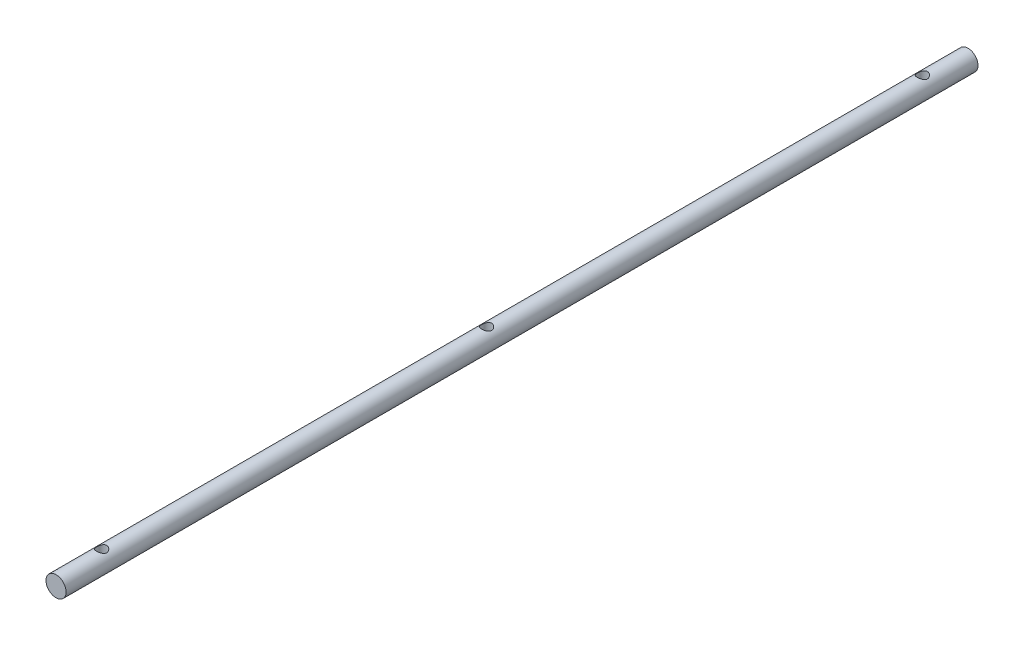
ISO-10303-21;
HEADER;
FILE_DESCRIPTION(('STEP AP214'),'2;1');
FILE_NAME('part.step','',(''),(''),'','','');
FILE_SCHEMA(('AUTOMOTIVE_DESIGN { 1 0 10303 214 1 1 1 1 }'));
ENDSEC;
DATA;
#1=APPLICATION_CONTEXT('core data for automotive mechanical design processes');
#2=APPLICATION_PROTOCOL_DEFINITION('international standard','automotive_design',2000,#1);
#3=PRODUCT_CONTEXT('',#1,'mechanical');
#4=PRODUCT('Part','Part','',(#3));
#5=PRODUCT_RELATED_PRODUCT_CATEGORY('part','',(#4));
#6=PRODUCT_DEFINITION_FORMATION('','',#4);
#7=PRODUCT_DEFINITION_CONTEXT('part definition',#1,'design');
#8=PRODUCT_DEFINITION('design','',#6,#7);
#9=PRODUCT_DEFINITION_SHAPE('','',#8);
#10=(LENGTH_UNIT() NAMED_UNIT(*) SI_UNIT(.MILLI.,.METRE.));
#11=(NAMED_UNIT(*) PLANE_ANGLE_UNIT() SI_UNIT($,.RADIAN.));
#12=(NAMED_UNIT(*) SI_UNIT($,.STERADIAN.) SOLID_ANGLE_UNIT());
#13=UNCERTAINTY_MEASURE_WITH_UNIT(LENGTH_MEASURE(1.E-05),#10,'distance_accuracy_value','');
#14=(GEOMETRIC_REPRESENTATION_CONTEXT(3) GLOBAL_UNCERTAINTY_ASSIGNED_CONTEXT((#13)) GLOBAL_UNIT_ASSIGNED_CONTEXT((#10,
#11,#12)) REPRESENTATION_CONTEXT('',''));
#15=CARTESIAN_POINT('',(0.,0.,0.));
#16=DIRECTION('',(0.,0.,1.));
#17=DIRECTION('',(1.,0.,0.));
#18=AXIS2_PLACEMENT_3D('',#15,#16,#17);
#19=CARTESIAN_POINT('',(0.,0.,180.));
#20=DIRECTION('',(0.,0.,-1.));
#21=DIRECTION('',(-1.,0.,0.));
#22=AXIS2_PLACEMENT_3D('',#19,#20,#21);
#23=CYLINDRICAL_SURFACE('',#22,1.985);
#24=CARTESIAN_POINT('',(0.,-1.985,172.));
#25=CARTESIAN_POINT('',(0.0525241934521383,-1.98499709998524,171.999996669648));
#26=CARTESIAN_POINT('',(0.105109572475808,-1.98289298866239,171.995837518645));
#27=CARTESIAN_POINT('',(0.208723131212675,-1.97468317302452,171.979386283019));
#28=CARTESIAN_POINT('',(0.259748227920028,-1.96857002233899,171.967079063806));
#29=CARTESIAN_POINT('',(0.358584817496942,-1.95298123682219,171.934936784323));
#30=CARTESIAN_POINT('',(0.406408013991505,-1.94351874408302,171.915131125455));
#31=CARTESIAN_POINT('',(0.497980094766749,-1.92209662070034,171.868708034434));
#32=CARTESIAN_POINT('',(0.541729260053034,-1.91013716246934,171.842091072563));
#33=CARTESIAN_POINT('',(0.626920340566818,-1.8839589234663,171.780951692587));
#34=CARTESIAN_POINT('',(0.668057627229285,-1.86964671080421,171.746045416825));
#35=CARTESIAN_POINT('',(0.744175429645126,-1.84067642852207,171.670145882927));
#36=CARTESIAN_POINT('',(0.779151177130402,-1.82601810091316,171.629147955442));
#37=CARTESIAN_POINT('',(0.844726412398074,-1.79667828249011,171.538344870349));
#38=CARTESIAN_POINT('',(0.874761576168353,-1.78208651754665,171.488099735372));
#39=CARTESIAN_POINT('',(0.925828498622337,-1.75610163129737,171.382460653936));
#40=CARTESIAN_POINT('',(0.946866758810692,-1.74470620225378,171.327070460844));
#41=CARTESIAN_POINT('',(0.977962258215524,-1.72745939219626,171.216111257642));
#42=CARTESIAN_POINT('',(0.988604688458017,-1.72131537077316,171.160754054373));
#43=CARTESIAN_POINT('',(1.00039444451587,-1.71449347689259,171.048727361861));
#44=CARTESIAN_POINT('',(1.00155141359765,-1.71381005301011,170.99205926413));
#45=CARTESIAN_POINT('',(0.994766400400463,-1.71775188224238,170.886447231421));
#46=CARTESIAN_POINT('',(0.987916019977249,-1.72174037778335,170.837403532545));
#47=CARTESIAN_POINT('',(0.967204892788313,-1.73345892495978,170.741286347629));
#48=CARTESIAN_POINT('',(0.953341855284975,-1.74119019916676,170.69421351083));
#49=CARTESIAN_POINT('',(0.91874984889584,-1.7596915057268,170.602029405654));
#50=CARTESIAN_POINT('',(0.897868692718916,-1.77052803073808,170.556989221728));
#51=CARTESIAN_POINT('',(0.849950726863592,-1.794023452402,170.470834210608));
#52=CARTESIAN_POINT('',(0.822911150231287,-1.8066831672637,170.429721159681));
#53=CARTESIAN_POINT('',(0.759378427776209,-1.83437118063029,170.347004770864));
#54=CARTESIAN_POINT('',(0.72211578625766,-1.84949437390446,170.306022147641));
#55=CARTESIAN_POINT('',(0.64119028512072,-1.87908398222496,170.230626713063));
#56=CARTESIAN_POINT('',(0.5975242959507,-1.89355007156648,170.196217133238));
#57=CARTESIAN_POINT('',(0.502390959336819,-1.92103921351319,170.133395714788));
#58=CARTESIAN_POINT('',(0.450650463877784,-1.93396022621985,170.105349221581));
#59=CARTESIAN_POINT('',(0.342370272283127,-1.95602925032836,170.058590288337));
#60=CARTESIAN_POINT('',(0.285834484066024,-1.96518029910159,170.039870331574));
#61=CARTESIAN_POINT('',(0.174638796336384,-1.97802752215794,170.013853977389));
#62=CARTESIAN_POINT('',(0.120217620535322,-1.98211598592697,170.005732942158));
#63=CARTESIAN_POINT('',(0.0106395919460779,-1.98572680268954,169.998552550789));
#64=CARTESIAN_POINT('',(-0.0445168914214424,-1.98525136822103,169.99948880376));
#65=CARTESIAN_POINT('',(-0.149367585062797,-1.98001361339531,170.009926629331));
#66=CARTESIAN_POINT('',(-0.199149261064418,-1.97559268557999,170.018746175197));
#67=CARTESIAN_POINT('',(-0.296423568974016,-1.96335483508245,170.043624456131));
#68=CARTESIAN_POINT('',(-0.343915949592989,-1.95553754053012,170.059683983916));
#69=CARTESIAN_POINT('',(-0.436820909524409,-1.9369361987971,170.098998006162));
#70=CARTESIAN_POINT('',(-0.482136779479153,-1.92607455140758,170.122443011987));
#71=CARTESIAN_POINT('',(-0.568339207234209,-1.90242387540179,170.175646237229));
#72=CARTESIAN_POINT('',(-0.609223880320048,-1.88963403215562,170.205407127177));
#73=CARTESIAN_POINT('',(-0.689711362911937,-1.86185678643581,170.273806171524));
#74=CARTESIAN_POINT('',(-0.728783469415603,-1.84677729033579,170.31303246682));
#75=CARTESIAN_POINT('',(-0.800033912790187,-1.81704822715469,170.397503530084));
#76=CARTESIAN_POINT('',(-0.832207301442066,-1.80239897512984,170.44275258052));
#77=CARTESIAN_POINT('',(-0.890279864300256,-1.77446286853786,170.540858910455));
#78=CARTESIAN_POINT('',(-0.915780796983251,-1.76128197841817,170.593984799445));
#79=CARTESIAN_POINT('',(-0.957207601663146,-1.73912006218529,170.704649044708));
#80=CARTESIAN_POINT('',(-0.973145989391468,-1.73013354978888,170.762181521741));
#81=CARTESIAN_POINT('',(-0.993510798790229,-1.71851288012506,170.874095714664));
#82=CARTESIAN_POINT('',(-0.998899207098404,-1.71534967666912,170.9282461894));
#83=CARTESIAN_POINT('',(-1.00079437443162,-1.71424586480591,171.036745478599));
#84=CARTESIAN_POINT('',(-0.997305182834827,-1.7163028752787,171.091094191346));
#85=CARTESIAN_POINT('',(-0.982446836613241,-1.72484287780959,171.192822776267));
#86=CARTESIAN_POINT('',(-0.971883851722708,-1.73087212952264,171.240363447639));
#87=CARTESIAN_POINT('',(-0.944185293079105,-1.74613506510732,171.332941910091));
#88=CARTESIAN_POINT('',(-0.927047578869897,-1.75536979245407,171.377978880599));
#89=CARTESIAN_POINT('',(-0.885402332548204,-1.77675808036112,171.467618997341));
#90=CARTESIAN_POINT('',(-0.860477544552348,-1.78906588367429,171.511990384098));
#91=CARTESIAN_POINT('',(-0.804420951868459,-1.81496144644592,171.596212214371));
#92=CARTESIAN_POINT('',(-0.773285892768316,-1.82854987502165,171.636060270242));
#93=CARTESIAN_POINT('',(-0.701166380998002,-1.85749279276764,171.715246269532));
#94=CARTESIAN_POINT('',(-0.659439260164994,-1.87285728042094,171.753907883738));
#95=CARTESIAN_POINT('',(-0.569672623204714,-1.90208430615258,171.823838603199));
#96=CARTESIAN_POINT('',(-0.521629663903826,-1.91594601739393,171.855103649887));
#97=CARTESIAN_POINT('',(-0.419841349907031,-1.94080553340147,171.909445181628));
#98=CARTESIAN_POINT('',(-0.366049705306482,-1.95177717153291,171.932447493215));
#99=CARTESIAN_POINT('',(-0.254709523057728,-1.96939078035678,171.968777921384));
#100=CARTESIAN_POINT('',(-0.197172105077722,-1.97604497585954,171.982133365277));
#101=CARTESIAN_POINT('',(-0.115858924621761,-1.9817512131365,171.993538070243));
#102=CARTESIAN_POINT('',(-0.0927747658330767,-1.98296622315105,171.995957751335));
#103=CARTESIAN_POINT('',(-0.046464399497669,-1.9845912691658,171.99918947502));
#104=CARTESIAN_POINT('',(-0.0232381880655996,-1.98500128304852,172.000001473442));
#105=CARTESIAN_POINT('',(0.,-1.985,172.));
#106=B_SPLINE_CURVE_WITH_KNOTS('',3,(#24,#25,#26,#27,#28,#29,#30,#31,#32,#33,#34,#35,#36,#37,
#38,#39,#40,#41,#42,#43,#44,#45,#46,#47,#48,#49,#50,#51,#52,#53,#54,#55,#56,#57,#58,#59,#60,#61,
#62,#63,#64,#65,#66,#67,#68,#69,#70,#71,#72,#73,#74,#75,#76,#77,#78,#79,#80,#81,#82,#83,#84,#85,
#86,#87,#88,#89,#90,#91,#92,#93,#94,#95,#96,#97,#98,#99,#100,#101,#102,#103,#104,#105),
.UNSPECIFIED.,.T.,.F.,(4,2,2,2,2,2,2,2,2,2,2,2,2,2,2,2,2,2,2,2,2,2,2,2,2,2,2,2,2,2,2,2,2,2,2,2,
2,2,2,2,4),(0.,0.157478352518463,0.315250036169847,0.472409398020829,0.629557911790198,
0.796314989729464,0.963200555448435,1.14327540337137,1.32321990156184,1.49232370861122,
1.661255577206,1.8096017058201,1.95799632414463,2.10984226765282,2.26175656999997,
2.433264804987,2.60485714346326,2.78465220550892,2.96430212626201,3.12892332049388,
3.29346471184279,3.44501633480585,3.59658455542481,3.7524362672466,3.90835400924324,
4.07975887742976,4.25128628034408,4.43146399060475,4.6114053617605,4.77399296586817,
4.93650642148319,5.08308552840491,5.22971239588756,5.38617509552953,5.54272000386117,
5.71868207703268,5.89474047947566,6.07234200918931,6.24943844104963,6.31910940198647,
6.38878227712389),.UNSPECIFIED.);
#107=CARTESIAN_POINT('',(0.,-1.985,172.));
#108=VERTEX_POINT('',#107);
#109=EDGE_CURVE('E10',#108,#108,#106,.T.);
#110=ORIENTED_EDGE('',*,*,#109,.T.);
#111=EDGE_LOOP('',(#110));
#112=FACE_BOUND('',#111,.T.);
#113=CARTESIAN_POINT('',(0.,1.985,172.));
#114=CARTESIAN_POINT('',(-0.0525241934521383,1.98499709998524,171.999996669648));
#115=CARTESIAN_POINT('',(-0.105109572475808,1.98289298866239,171.995837518645));
#116=CARTESIAN_POINT('',(-0.208723131212675,1.97468317302452,171.979386283019));
#117=CARTESIAN_POINT('',(-0.259748227920028,1.96857002233899,171.967079063806));
#118=CARTESIAN_POINT('',(-0.358584817496942,1.95298123682219,171.934936784323));
#119=CARTESIAN_POINT('',(-0.406408013991505,1.94351874408302,171.915131125455));
#120=CARTESIAN_POINT('',(-0.497980094766749,1.92209662070034,171.868708034434));
#121=CARTESIAN_POINT('',(-0.541729260053034,1.91013716246934,171.842091072563));
#122=CARTESIAN_POINT('',(-0.626920340566818,1.8839589234663,171.780951692587));
#123=CARTESIAN_POINT('',(-0.668057627229285,1.86964671080421,171.746045416825));
#124=CARTESIAN_POINT('',(-0.744175429645126,1.84067642852207,171.670145882927));
#125=CARTESIAN_POINT('',(-0.779151177130402,1.82601810091316,171.629147955442));
#126=CARTESIAN_POINT('',(-0.844726412398074,1.79667828249011,171.538344870349));
#127=CARTESIAN_POINT('',(-0.874761576168353,1.78208651754665,171.488099735372));
#128=CARTESIAN_POINT('',(-0.925828498622337,1.75610163129737,171.382460653936));
#129=CARTESIAN_POINT('',(-0.946866758810692,1.74470620225378,171.327070460844));
#130=CARTESIAN_POINT('',(-0.977962258215524,1.72745939219626,171.216111257642));
#131=CARTESIAN_POINT('',(-0.988604688458017,1.72131537077316,171.160754054373));
#132=CARTESIAN_POINT('',(-1.00039444451587,1.71449347689259,171.048727361861));
#133=CARTESIAN_POINT('',(-1.00155141359765,1.71381005301011,170.99205926413));
#134=CARTESIAN_POINT('',(-0.994766400400463,1.71775188224238,170.886447231421));
#135=CARTESIAN_POINT('',(-0.987916019977249,1.72174037778335,170.837403532545));
#136=CARTESIAN_POINT('',(-0.967204892788313,1.73345892495978,170.741286347629));
#137=CARTESIAN_POINT('',(-0.953341855284975,1.74119019916676,170.69421351083));
#138=CARTESIAN_POINT('',(-0.91874984889584,1.7596915057268,170.602029405654));
#139=CARTESIAN_POINT('',(-0.897868692718916,1.77052803073808,170.556989221728));
#140=CARTESIAN_POINT('',(-0.849950726863592,1.794023452402,170.470834210608));
#141=CARTESIAN_POINT('',(-0.822911150231287,1.8066831672637,170.429721159681));
#142=CARTESIAN_POINT('',(-0.759378427776209,1.83437118063029,170.347004770864));
#143=CARTESIAN_POINT('',(-0.72211578625766,1.84949437390446,170.306022147641));
#144=CARTESIAN_POINT('',(-0.64119028512072,1.87908398222496,170.230626713063));
#145=CARTESIAN_POINT('',(-0.5975242959507,1.89355007156648,170.196217133238));
#146=CARTESIAN_POINT('',(-0.502390959336819,1.92103921351319,170.133395714788));
#147=CARTESIAN_POINT('',(-0.450650463877784,1.93396022621985,170.105349221581));
#148=CARTESIAN_POINT('',(-0.342370272283127,1.95602925032836,170.058590288337));
#149=CARTESIAN_POINT('',(-0.285834484066024,1.96518029910159,170.039870331574));
#150=CARTESIAN_POINT('',(-0.174638796336384,1.97802752215794,170.013853977389));
#151=CARTESIAN_POINT('',(-0.120217620535322,1.98211598592697,170.005732942158));
#152=CARTESIAN_POINT('',(-0.0106395919460779,1.98572680268954,169.998552550789));
#153=CARTESIAN_POINT('',(0.0445168914214424,1.98525136822103,169.99948880376));
#154=CARTESIAN_POINT('',(0.149367585062797,1.98001361339531,170.009926629331));
#155=CARTESIAN_POINT('',(0.199149261064418,1.97559268557999,170.018746175197));
#156=CARTESIAN_POINT('',(0.296423568974016,1.96335483508245,170.043624456131));
#157=CARTESIAN_POINT('',(0.343915949592989,1.95553754053012,170.059683983916));
#158=CARTESIAN_POINT('',(0.436820909524409,1.9369361987971,170.098998006162));
#159=CARTESIAN_POINT('',(0.482136779479153,1.92607455140758,170.122443011987));
#160=CARTESIAN_POINT('',(0.568339207234209,1.90242387540179,170.175646237229));
#161=CARTESIAN_POINT('',(0.609223880320048,1.88963403215562,170.205407127177));
#162=CARTESIAN_POINT('',(0.689711362911937,1.86185678643581,170.273806171524));
#163=CARTESIAN_POINT('',(0.728783469415603,1.84677729033579,170.31303246682));
#164=CARTESIAN_POINT('',(0.800033912790187,1.81704822715469,170.397503530084));
#165=CARTESIAN_POINT('',(0.832207301442066,1.80239897512984,170.44275258052));
#166=CARTESIAN_POINT('',(0.890279864300256,1.77446286853786,170.540858910455));
#167=CARTESIAN_POINT('',(0.915780796983251,1.76128197841817,170.593984799445));
#168=CARTESIAN_POINT('',(0.957207601663146,1.73912006218529,170.704649044708));
#169=CARTESIAN_POINT('',(0.973145989391468,1.73013354978888,170.762181521741));
#170=CARTESIAN_POINT('',(0.993510798790229,1.71851288012506,170.874095714664));
#171=CARTESIAN_POINT('',(0.998899207098404,1.71534967666912,170.9282461894));
#172=CARTESIAN_POINT('',(1.00079437443162,1.71424586480591,171.036745478599));
#173=CARTESIAN_POINT('',(0.997305182834827,1.7163028752787,171.091094191346));
#174=CARTESIAN_POINT('',(0.982446836613241,1.72484287780959,171.192822776267));
#175=CARTESIAN_POINT('',(0.971883851722708,1.73087212952264,171.240363447639));
#176=CARTESIAN_POINT('',(0.944185293079105,1.74613506510732,171.332941910091));
#177=CARTESIAN_POINT('',(0.927047578869897,1.75536979245407,171.377978880599));
#178=CARTESIAN_POINT('',(0.885402332548204,1.77675808036112,171.467618997341));
#179=CARTESIAN_POINT('',(0.860477544552348,1.78906588367429,171.511990384098));
#180=CARTESIAN_POINT('',(0.804420951868459,1.81496144644592,171.596212214371));
#181=CARTESIAN_POINT('',(0.773285892768316,1.82854987502165,171.636060270242));
#182=CARTESIAN_POINT('',(0.701166380998002,1.85749279276764,171.715246269532));
#183=CARTESIAN_POINT('',(0.659439260164994,1.87285728042094,171.753907883738));
#184=CARTESIAN_POINT('',(0.569672623204714,1.90208430615258,171.823838603199));
#185=CARTESIAN_POINT('',(0.521629663903826,1.91594601739393,171.855103649887));
#186=CARTESIAN_POINT('',(0.419841349907031,1.94080553340147,171.909445181628));
#187=CARTESIAN_POINT('',(0.366049705306482,1.95177717153291,171.932447493215));
#188=CARTESIAN_POINT('',(0.254709523057728,1.96939078035678,171.968777921384));
#189=CARTESIAN_POINT('',(0.197172105077722,1.97604497585954,171.982133365277));
#190=CARTESIAN_POINT('',(0.115858924621761,1.9817512131365,171.993538070243));
#191=CARTESIAN_POINT('',(0.0927747658330767,1.98296622315105,171.995957751335));
#192=CARTESIAN_POINT('',(0.046464399497669,1.9845912691658,171.99918947502));
#193=CARTESIAN_POINT('',(0.0232381880655996,1.98500128304852,172.000001473442));
#194=CARTESIAN_POINT('',(0.,1.985,172.));
#195=B_SPLINE_CURVE_WITH_KNOTS('',3,(#113,#114,#115,#116,#117,#118,#119,#120,#121,#122,#123,
#124,#125,#126,#127,#128,#129,#130,#131,#132,#133,#134,#135,#136,#137,#138,#139,#140,#141,#142,
#143,#144,#145,#146,#147,#148,#149,#150,#151,#152,#153,#154,#155,#156,#157,#158,#159,#160,#161,
#162,#163,#164,#165,#166,#167,#168,#169,#170,#171,#172,#173,#174,#175,#176,#177,#178,#179,#180,
#181,#182,#183,#184,#185,#186,#187,#188,#189,#190,#191,#192,#193,#194),.UNSPECIFIED.,.T.,.F.,(4,
2,2,2,2,2,2,2,2,2,2,2,2,2,2,2,2,2,2,2,2,2,2,2,2,2,2,2,2,2,2,2,2,2,2,2,2,2,2,2,4),(0.,
0.157478352518463,0.315250036169847,0.472409398020829,0.629557911790198,0.796314989729464,
0.963200555448435,1.14327540337137,1.32321990156184,1.49232370861122,1.661255577206,
1.8096017058201,1.95799632414463,2.10984226765282,2.26175656999997,2.433264804987,
2.60485714346326,2.78465220550892,2.96430212626201,3.12892332049388,3.29346471184279,
3.44501633480585,3.59658455542481,3.7524362672466,3.90835400924324,4.07975887742976,
4.25128628034408,4.43146399060475,4.6114053617605,4.77399296586817,4.93650642148319,
5.08308552840491,5.22971239588756,5.38617509552953,5.54272000386117,5.71868207703268,
5.89474047947566,6.07234200918931,6.24943844104963,6.31910940198647,6.38878227712389),.UNSPECIFIED.);
#196=CARTESIAN_POINT('',(0.,1.985,172.));
#197=VERTEX_POINT('',#196);
#198=EDGE_CURVE('E53',#197,#197,#195,.T.);
#199=ORIENTED_EDGE('',*,*,#198,.T.);
#200=EDGE_LOOP('',(#199));
#201=FACE_BOUND('',#200,.T.);
#202=CARTESIAN_POINT('',(0.,-1.985,10.));
#203=CARTESIAN_POINT('',(0.0525241934521387,-1.98499709998524,9.99999666964779));
#204=CARTESIAN_POINT('',(0.105109572475808,-1.98289298866239,9.9958375186454));
#205=CARTESIAN_POINT('',(0.208723131212673,-1.97468317302452,9.97938628301897));
#206=CARTESIAN_POINT('',(0.259748227920024,-1.96857002233899,9.96707906380586));
#207=CARTESIAN_POINT('',(0.358584817496939,-1.95298123682219,9.93493678432272));
#208=CARTESIAN_POINT('',(0.406408013991505,-1.94351874408302,9.91513112545532));
#209=CARTESIAN_POINT('',(0.497980094766747,-1.92209662070034,9.8687080344336));
#210=CARTESIAN_POINT('',(0.541729260053028,-1.91013716246934,9.8420910725631));
#211=CARTESIAN_POINT('',(0.626920340566815,-1.8839589234663,9.78095169258689));
#212=CARTESIAN_POINT('',(0.668057627229289,-1.8696467108042,9.74604541682501));
#213=CARTESIAN_POINT('',(0.74417542964513,-1.84067642852207,9.67014588292726));
#214=CARTESIAN_POINT('',(0.779151177130399,-1.82601810091316,9.62914795544179));
#215=CARTESIAN_POINT('',(0.844726412398069,-1.79667828249012,9.53834487034894));
#216=CARTESIAN_POINT('',(0.874761576168353,-1.78208651754665,9.48809973537205));
#217=CARTESIAN_POINT('',(0.925828498622337,-1.75610163129737,9.38246065393563));
#218=CARTESIAN_POINT('',(0.946866758810689,-1.74470620225379,9.32707046084372));
#219=CARTESIAN_POINT('',(0.977962258215523,-1.72745939219626,9.21611125764175));
#220=CARTESIAN_POINT('',(0.988604688458019,-1.72131537077316,9.16075405437338));
#221=CARTESIAN_POINT('',(1.00039444451587,-1.71449347689259,9.04872736186137));
#222=CARTESIAN_POINT('',(1.00155141359765,-1.71381005301011,8.99205926412989));
#223=CARTESIAN_POINT('',(0.994766400400463,-1.71775188224238,8.88644723142093));
#224=CARTESIAN_POINT('',(0.987916019977249,-1.72174037778335,8.83740353254501));
#225=CARTESIAN_POINT('',(0.967204892788312,-1.73345892495978,8.74128634762929));
#226=CARTESIAN_POINT('',(0.953341855284972,-1.74119019916677,8.69421351083042));
#227=CARTESIAN_POINT('',(0.918749848895833,-1.7596915057268,8.60202940565378));
#228=CARTESIAN_POINT('',(0.897868692718906,-1.77052803073808,8.55698922172797));
#229=CARTESIAN_POINT('',(0.849950726863585,-1.79402345240201,8.47083421060798));
#230=CARTESIAN_POINT('',(0.822911150231286,-1.8066831672637,8.42972115968055));
#231=CARTESIAN_POINT('',(0.759378427776211,-1.83437118063029,8.3470047708636));
#232=CARTESIAN_POINT('',(0.722115786257657,-1.84949437390447,8.30602214764138));
#233=CARTESIAN_POINT('',(0.641190285120715,-1.87908398222496,8.23062671306291));
#234=CARTESIAN_POINT('',(0.597524295950699,-1.89355007156648,8.19621713323848));
#235=CARTESIAN_POINT('',(0.502390959336818,-1.92103921351319,8.13339571478833));
#236=CARTESIAN_POINT('',(0.450650463877779,-1.93396022621985,8.10534922158111));
#237=CARTESIAN_POINT('',(0.34237027228312,-1.95602925032837,8.05859028833746));
#238=CARTESIAN_POINT('',(0.285834484066021,-1.96518029910159,8.03987033157388));
#239=CARTESIAN_POINT('',(0.174638796336382,-1.97802752215794,8.01385397738904));
#240=CARTESIAN_POINT('',(0.120217620535319,-1.98211598592697,8.00573294215766));
#241=CARTESIAN_POINT('',(0.0106395919460757,-1.98572680268954,7.99855255078919));
#242=CARTESIAN_POINT('',(-0.0445168914214434,-1.98525136822103,7.99948880375971));
#243=CARTESIAN_POINT('',(-0.149367585062794,-1.98001361339531,8.00992662933088));
#244=CARTESIAN_POINT('',(-0.199149261064412,-1.97559268557999,8.01874617519693));
#245=CARTESIAN_POINT('',(-0.296423568974011,-1.96335483508245,8.04362445613124));
#246=CARTESIAN_POINT('',(-0.343915949592987,-1.95553754053012,8.05968398391643));
#247=CARTESIAN_POINT('',(-0.43682090952441,-1.9369361987971,8.09899800616214));
#248=CARTESIAN_POINT('',(-0.482136779479154,-1.92607455140758,8.122443011987));
#249=CARTESIAN_POINT('',(-0.568339207234209,-1.90242387540179,8.17564623722934));
#250=CARTESIAN_POINT('',(-0.609223880320047,-1.88963403215562,8.20540712717711));
#251=CARTESIAN_POINT('',(-0.689711362911937,-1.86185678643582,8.27380617152435));
#252=CARTESIAN_POINT('',(-0.728783469415606,-1.84677729033579,8.31303246681959));
#253=CARTESIAN_POINT('',(-0.800033912790192,-1.81704822715468,8.39750353008393));
#254=CARTESIAN_POINT('',(-0.832207301442071,-1.80239897512984,8.44275258052042));
#255=CARTESIAN_POINT('',(-0.890279864300259,-1.77446286853786,8.54085891045521));
#256=CARTESIAN_POINT('',(-0.915780796983251,-1.76128197841817,8.59398479944544));
#257=CARTESIAN_POINT('',(-0.957207601663144,-1.73912006218529,8.70464904470798));
#258=CARTESIAN_POINT('',(-0.973145989391466,-1.73013354978888,8.76218152174079));
#259=CARTESIAN_POINT('',(-0.993510798790227,-1.71851288012506,8.87409571466398));
#260=CARTESIAN_POINT('',(-0.998899207098401,-1.71534967666912,8.92824618939989));
#261=CARTESIAN_POINT('',(-1.00079437443162,-1.71424586480591,9.03674547859893));
#262=CARTESIAN_POINT('',(-0.997305182834826,-1.7163028752787,9.0910941913463));
#263=CARTESIAN_POINT('',(-0.98244683661324,-1.72484287780959,9.19282277626688));
#264=CARTESIAN_POINT('',(-0.971883851722708,-1.73087212952264,9.24036344763862));
#265=CARTESIAN_POINT('',(-0.944185293079106,-1.74613506510732,9.33294191009074));
#266=CARTESIAN_POINT('',(-0.927047578869897,-1.75536979245407,9.37797888059852));
#267=CARTESIAN_POINT('',(-0.885402332548205,-1.77675808036112,9.46761899734086));
#268=CARTESIAN_POINT('',(-0.860477544552352,-1.78906588367429,9.51199038409791));
#269=CARTESIAN_POINT('',(-0.804420951868464,-1.81496144644592,9.59621221437094));
#270=CARTESIAN_POINT('',(-0.77328589276832,-1.82854987502165,9.63606027024179));
#271=CARTESIAN_POINT('',(-0.701166380998006,-1.85749279276764,9.71524626953195));
#272=CARTESIAN_POINT('',(-0.659439260165,-1.87285728042094,9.75390788373805));
#273=CARTESIAN_POINT('',(-0.569672623204717,-1.90208430615258,9.823838603199));
#274=CARTESIAN_POINT('',(-0.521629663903825,-1.91594601739393,9.85510364988712));
#275=CARTESIAN_POINT('',(-0.419841349907022,-1.94080553340147,9.90944518162782));
#276=CARTESIAN_POINT('',(-0.366049705306471,-1.95177717153292,9.93244749321549));
#277=CARTESIAN_POINT('',(-0.25470952305772,-1.96939078035678,9.96877792138429));
#278=CARTESIAN_POINT('',(-0.197172105077719,-1.97604497585954,9.98213336527738));
#279=CARTESIAN_POINT('',(-0.115858924621759,-1.9817512131365,9.99353807024347));
#280=CARTESIAN_POINT('',(-0.0927747658330752,-1.98296622315105,9.9959577513346));
#281=CARTESIAN_POINT('',(-0.0464643994976677,-1.9845912691658,9.99918947501959));
#282=CARTESIAN_POINT('',(-0.0232381880655985,-1.98500128304852,10.000001473442));
#283=CARTESIAN_POINT('',(0.,-1.985,10.));
#284=B_SPLINE_CURVE_WITH_KNOTS('',3,(#202,#203,#204,#205,#206,#207,#208,#209,#210,#211,#212,
#213,#214,#215,#216,#217,#218,#219,#220,#221,#222,#223,#224,#225,#226,#227,#228,#229,#230,#231,
#232,#233,#234,#235,#236,#237,#238,#239,#240,#241,#242,#243,#244,#245,#246,#247,#248,#249,#250,
#251,#252,#253,#254,#255,#256,#257,#258,#259,#260,#261,#262,#263,#264,#265,#266,#267,#268,#269,
#270,#271,#272,#273,#274,#275,#276,#277,#278,#279,#280,#281,#282,#283),.UNSPECIFIED.,.T.,.F.,(4,
2,2,2,2,2,2,2,2,2,2,2,2,2,2,2,2,2,2,2,2,2,2,2,2,2,2,2,2,2,2,2,2,2,2,2,2,2,2,2,4),(0.,
0.15747835251846,0.315250036169847,0.472409398020827,0.629557911790194,0.796314989729467,
0.963200555448432,1.14327540337136,1.32321990156182,1.49232370861123,1.66125557720601,
1.80960170582012,1.95799632414464,2.10984226765284,2.26175656999997,2.43326480498701,
2.60485714346327,2.78465220550892,2.96430212626201,3.12892332049388,3.29346471184279,
3.44501633480584,3.59658455542481,3.7524362672466,3.90835400924325,4.07975887742977,
4.25128628034409,4.43146399060476,4.6114053617605,4.77399296586815,4.93650642148318,
5.08308552840489,5.22971239588755,5.38617509552954,5.54272000386115,5.71868207703267,
5.89474047947567,6.07234200918931,6.24943844104963,6.31910940198647,6.38878227712389),.UNSPECIFIED.);
#285=CARTESIAN_POINT('',(0.,-1.985,10.));
#286=VERTEX_POINT('',#285);
#287=EDGE_CURVE('E57',#286,#286,#284,.T.);
#288=ORIENTED_EDGE('',*,*,#287,.T.);
#289=EDGE_LOOP('',(#288));
#290=FACE_BOUND('',#289,.T.);
#291=CARTESIAN_POINT('',(0.,1.985,10.));
#292=CARTESIAN_POINT('',(-0.0525241934521375,1.98499709998524,9.99999666964778));
#293=CARTESIAN_POINT('',(-0.105109572475807,1.98289298866239,9.9958375186454));
#294=CARTESIAN_POINT('',(-0.208723131212672,1.97468317302452,9.97938628301897));
#295=CARTESIAN_POINT('',(-0.259748227920023,1.96857002233899,9.96707906380586));
#296=CARTESIAN_POINT('',(-0.358584817496937,1.95298123682219,9.93493678432272));
#297=CARTESIAN_POINT('',(-0.406408013991503,1.94351874408302,9.91513112545532));
#298=CARTESIAN_POINT('',(-0.497980094766746,1.92209662070034,9.8687080344336));
#299=CARTESIAN_POINT('',(-0.541729260053027,1.91013716246935,9.8420910725631));
#300=CARTESIAN_POINT('',(-0.626920340566813,1.8839589234663,9.78095169258689));
#301=CARTESIAN_POINT('',(-0.668057627229288,1.8696467108042,9.74604541682501));
#302=CARTESIAN_POINT('',(-0.744175429645129,1.84067642852207,9.67014588292726));
#303=CARTESIAN_POINT('',(-0.779151177130397,1.82601810091317,9.62914795544179));
#304=CARTESIAN_POINT('',(-0.844726412398067,1.79667828249012,9.53834487034894));
#305=CARTESIAN_POINT('',(-0.874761576168351,1.78208651754665,9.48809973537205));
#306=CARTESIAN_POINT('',(-0.925828498622335,1.75610163129737,9.38246065393563));
#307=CARTESIAN_POINT('',(-0.946866758810687,1.74470620225379,9.32707046084372));
#308=CARTESIAN_POINT('',(-0.977962258215521,1.72745939219626,9.21611125764175));
#309=CARTESIAN_POINT('',(-0.988604688458017,1.72131537077316,9.16075405437338));
#310=CARTESIAN_POINT('',(-1.00039444451587,1.71449347689259,9.04872736186137));
#311=CARTESIAN_POINT('',(-1.00155141359765,1.71381005301011,8.99205926412989));
#312=CARTESIAN_POINT('',(-0.994766400400461,1.71775188224238,8.88644723142093));
#313=CARTESIAN_POINT('',(-0.987916019977247,1.72174037778336,8.83740353254501));
#314=CARTESIAN_POINT('',(-0.967204892788309,1.73345892495978,8.74128634762929));
#315=CARTESIAN_POINT('',(-0.953341855284969,1.74119019916677,8.69421351083042));
#316=CARTESIAN_POINT('',(-0.918749848895831,1.7596915057268,8.60202940565378));
#317=CARTESIAN_POINT('',(-0.897868692718904,1.77052803073808,8.55698922172797));
#318=CARTESIAN_POINT('',(-0.849950726863583,1.79402345240201,8.47083421060798));
#319=CARTESIAN_POINT('',(-0.822911150231283,1.8066831672637,8.42972115968055));
#320=CARTESIAN_POINT('',(-0.759378427776208,1.83437118063029,8.3470047708636));
#321=CARTESIAN_POINT('',(-0.722115786257653,1.84949437390447,8.30602214764138));
#322=CARTESIAN_POINT('',(-0.641190285120712,1.87908398222496,8.23062671306291));
#323=CARTESIAN_POINT('',(-0.597524295950695,1.89355007156648,8.19621713323848));
#324=CARTESIAN_POINT('',(-0.502390959336814,1.92103921351319,8.13339571478833));
#325=CARTESIAN_POINT('',(-0.450650463877776,1.93396022621985,8.10534922158111));
#326=CARTESIAN_POINT('',(-0.342370272283118,1.95602925032837,8.05859028833746));
#327=CARTESIAN_POINT('',(-0.285834484066018,1.96518029910159,8.03987033157387));
#328=CARTESIAN_POINT('',(-0.17463879633638,1.97802752215794,8.01385397738904));
#329=CARTESIAN_POINT('',(-0.120217620535317,1.98211598592697,8.00573294215766));
#330=CARTESIAN_POINT('',(-0.0106395919460733,1.98572680268954,7.99855255078919));
#331=CARTESIAN_POINT('',(0.0445168914214459,1.98525136822103,7.99948880375971));
#332=CARTESIAN_POINT('',(0.149367585062796,1.98001361339531,8.00992662933088));
#333=CARTESIAN_POINT('',(0.199149261064414,1.97559268557999,8.01874617519693));
#334=CARTESIAN_POINT('',(0.296423568974014,1.96335483508245,8.04362445613124));
#335=CARTESIAN_POINT('',(0.343915949592989,1.95553754053012,8.05968398391643));
#336=CARTESIAN_POINT('',(0.436820909524413,1.9369361987971,8.09899800616214));
#337=CARTESIAN_POINT('',(0.482136779479157,1.92607455140758,8.122443011987));
#338=CARTESIAN_POINT('',(0.568339207234212,1.90242387540179,8.17564623722934));
#339=CARTESIAN_POINT('',(0.60922388032005,1.88963403215562,8.20540712717711));
#340=CARTESIAN_POINT('',(0.68971136291194,1.86185678643581,8.27380617152436));
#341=CARTESIAN_POINT('',(0.728783469415609,1.84677729033579,8.31303246681959));
#342=CARTESIAN_POINT('',(0.800033912790196,1.81704822715468,8.39750353008393));
#343=CARTESIAN_POINT('',(0.832207301442075,1.80239897512984,8.44275258052042));
#344=CARTESIAN_POINT('',(0.890279864300261,1.77446286853785,8.54085891045521));
#345=CARTESIAN_POINT('',(0.915780796983254,1.76128197841817,8.59398479944544));
#346=CARTESIAN_POINT('',(0.957207601663146,1.73912006218529,8.70464904470798));
#347=CARTESIAN_POINT('',(0.973145989391468,1.73013354978888,8.76218152174079));
#348=CARTESIAN_POINT('',(0.993510798790229,1.71851288012506,8.87409571466398));
#349=CARTESIAN_POINT('',(0.998899207098403,1.71534967666912,8.92824618939989));
#350=CARTESIAN_POINT('',(1.00079437443162,1.71424586480591,9.03674547859894));
#351=CARTESIAN_POINT('',(0.997305182834828,1.7163028752787,9.0910941913463));
#352=CARTESIAN_POINT('',(0.982446836613242,1.72484287780959,9.19282277626688));
#353=CARTESIAN_POINT('',(0.971883851722711,1.73087212952263,9.24036344763862));
#354=CARTESIAN_POINT('',(0.944185293079109,1.74613506510732,9.33294191009074));
#355=CARTESIAN_POINT('',(0.927047578869899,1.75536979245407,9.37797888059852));
#356=CARTESIAN_POINT('',(0.885402332548207,1.77675808036112,9.46761899734086));
#357=CARTESIAN_POINT('',(0.860477544552354,1.78906588367428,9.51199038409791));
#358=CARTESIAN_POINT('',(0.804420951868466,1.81496144644592,9.59621221437094));
#359=CARTESIAN_POINT('',(0.773285892768322,1.82854987502165,9.63606027024179));
#360=CARTESIAN_POINT('',(0.701166380998008,1.85749279276764,9.71524626953195));
#361=CARTESIAN_POINT('',(0.659439260165002,1.87285728042094,9.75390788373805));
#362=CARTESIAN_POINT('',(0.56967262320472,1.90208430615258,9.823838603199));
#363=CARTESIAN_POINT('',(0.521629663903827,1.91594601739393,9.85510364988712));
#364=CARTESIAN_POINT('',(0.419841349907025,1.94080553340147,9.90944518162782));
#365=CARTESIAN_POINT('',(0.366049705306473,1.95177717153292,9.93244749321549));
#366=CARTESIAN_POINT('',(0.254709523057722,1.96939078035678,9.96877792138429));
#367=CARTESIAN_POINT('',(0.197172105077721,1.97604497585954,9.98213336527738));
#368=CARTESIAN_POINT('',(0.115858924621761,1.9817512131365,9.99353807024347));
#369=CARTESIAN_POINT('',(0.0927747658330774,1.98296622315105,9.9959577513346));
#370=CARTESIAN_POINT('',(0.0464643994976696,1.9845912691658,9.99918947501959));
#371=CARTESIAN_POINT('',(0.0232381880656,1.98500128304852,10.000001473442));
#372=CARTESIAN_POINT('',(0.,1.985,10.));
#373=B_SPLINE_CURVE_WITH_KNOTS('',3,(#291,#292,#293,#294,#295,#296,#297,#298,#299,#300,#301,
#302,#303,#304,#305,#306,#307,#308,#309,#310,#311,#312,#313,#314,#315,#316,#317,#318,#319,#320,
#321,#322,#323,#324,#325,#326,#327,#328,#329,#330,#331,#332,#333,#334,#335,#336,#337,#338,#339,
#340,#341,#342,#343,#344,#345,#346,#347,#348,#349,#350,#351,#352,#353,#354,#355,#356,#357,#358,
#359,#360,#361,#362,#363,#364,#365,#366,#367,#368,#369,#370,#371,#372),.UNSPECIFIED.,.T.,.F.,(4,
2,2,2,2,2,2,2,2,2,2,2,2,2,2,2,2,2,2,2,2,2,2,2,2,2,2,2,2,2,2,2,2,2,2,2,2,2,2,2,4),(0.,
0.15747835251846,0.315250036169847,0.472409398020826,0.629557911790193,0.796314989729466,
0.963200555448431,1.14327540337136,1.32321990156182,1.49232370861123,1.66125557720601,
1.80960170582012,1.95799632414464,2.10984226765284,2.26175656999997,2.43326480498701,
2.60485714346327,2.78465220550892,2.96430212626201,3.12892332049388,3.29346471184279,
3.44501633480584,3.59658455542481,3.7524362672466,3.90835400924325,4.07975887742977,
4.25128628034409,4.43146399060476,4.61140536176051,4.77399296586816,4.93650642148318,
5.08308552840489,5.22971239588755,5.38617509552954,5.54272000386115,5.71868207703267,
5.89474047947567,6.07234200918931,6.24943844104963,6.31910940198647,6.38878227712389),.UNSPECIFIED.);
#374=CARTESIAN_POINT('',(0.,1.985,10.));
#375=VERTEX_POINT('',#374);
#376=EDGE_CURVE('E61',#375,#375,#373,.T.);
#377=ORIENTED_EDGE('',*,*,#376,.T.);
#378=EDGE_LOOP('',(#377));
#379=FACE_BOUND('',#378,.T.);
#380=CARTESIAN_POINT('',(0.,-1.985,96.02));
#381=CARTESIAN_POINT('',(0.0525241934521378,-1.98499709998524,96.0199966696478));
#382=CARTESIAN_POINT('',(0.105109572475808,-1.98289298866239,96.0158375186454));
#383=CARTESIAN_POINT('',(0.208723131212672,-1.97468317302452,95.999386283019));
#384=CARTESIAN_POINT('',(0.259748227920023,-1.96857002233899,95.9870790638059));
#385=CARTESIAN_POINT('',(0.358584817496937,-1.95298123682219,95.9549367843227));
#386=CARTESIAN_POINT('',(0.406408013991502,-1.94351874408302,95.9351311254553));
#387=CARTESIAN_POINT('',(0.497980094766746,-1.92209662070034,95.8887080344336));
#388=CARTESIAN_POINT('',(0.541729260053028,-1.91013716246934,95.8620910725631));
#389=CARTESIAN_POINT('',(0.626920340566816,-1.8839589234663,95.8009516925869));
#390=CARTESIAN_POINT('',(0.668057627229292,-1.8696467108042,95.766045416825));
#391=CARTESIAN_POINT('',(0.744175429645132,-1.84067642852207,95.6901458829273));
#392=CARTESIAN_POINT('',(0.779151177130401,-1.82601810091316,95.6491479554418));
#393=CARTESIAN_POINT('',(0.844726412398069,-1.79667828249012,95.5583448703489));
#394=CARTESIAN_POINT('',(0.874761576168352,-1.78208651754665,95.5080997353721));
#395=CARTESIAN_POINT('',(0.925828498622334,-1.75610163129737,95.4024606539356));
#396=CARTESIAN_POINT('',(0.946866758810686,-1.74470620225379,95.3470704608437));
#397=CARTESIAN_POINT('',(0.977962258215521,-1.72745939219626,95.2361112576418));
#398=CARTESIAN_POINT('',(0.988604688458018,-1.72131537077316,95.1807540543734));
#399=CARTESIAN_POINT('',(1.00039444451587,-1.71449347689259,95.0687273618614));
#400=CARTESIAN_POINT('',(1.00155141359765,-1.71381005301011,95.0120592641299));
#401=CARTESIAN_POINT('',(0.994766400400462,-1.71775188224238,94.9064472314209));
#402=CARTESIAN_POINT('',(0.987916019977248,-1.72174037778336,94.857403532545));
#403=CARTESIAN_POINT('',(0.967204892788308,-1.73345892495978,94.7612863476293));
#404=CARTESIAN_POINT('',(0.953341855284967,-1.74119019916677,94.7142135108304));
#405=CARTESIAN_POINT('',(0.918749848895828,-1.7596915057268,94.6220294056538));
#406=CARTESIAN_POINT('',(0.897868692718903,-1.77052803073808,94.576989221728));
#407=CARTESIAN_POINT('',(0.849950726863582,-1.79402345240201,94.490834210608));
#408=CARTESIAN_POINT('',(0.822911150231282,-1.8066831672637,94.4497211596805));
#409=CARTESIAN_POINT('',(0.759378427776205,-1.83437118063029,94.3670047708636));
#410=CARTESIAN_POINT('',(0.722115786257651,-1.84949437390447,94.3260221476414));
#411=CARTESIAN_POINT('',(0.641190285120712,-1.87908398222496,94.2506267130629));
#412=CARTESIAN_POINT('',(0.597524295950697,-1.89355007156648,94.2162171332385));
#413=CARTESIAN_POINT('',(0.502390959336821,-1.92103921351318,94.1533957147883));
#414=CARTESIAN_POINT('',(0.450650463877785,-1.93396022621985,94.1253492215811));
#415=CARTESIAN_POINT('',(0.342370272283126,-1.95602925032836,94.0785902883375));
#416=CARTESIAN_POINT('',(0.285834484066022,-1.96518029910159,94.0598703315739));
#417=CARTESIAN_POINT('',(0.17463879633638,-1.97802752215794,94.033853977389));
#418=CARTESIAN_POINT('',(0.120217620535316,-1.98211598592697,94.0257329421577));
#419=CARTESIAN_POINT('',(0.0106395919460713,-1.98572680268954,94.0185525507892));
#420=CARTESIAN_POINT('',(-0.0445168914214488,-1.98525136822103,94.0194888037597));
#421=CARTESIAN_POINT('',(-0.149367585062799,-1.98001361339531,94.0299266293309));
#422=CARTESIAN_POINT('',(-0.199149261064417,-1.97559268557999,94.0387461751969));
#423=CARTESIAN_POINT('',(-0.296423568974015,-1.96335483508245,94.0636244561312));
#424=CARTESIAN_POINT('',(-0.343915949592991,-1.95553754053012,94.0796839839164));
#425=CARTESIAN_POINT('',(-0.436820909524409,-1.9369361987971,94.1189980061621));
#426=CARTESIAN_POINT('',(-0.482136779479147,-1.92607455140759,94.142443011987));
#427=CARTESIAN_POINT('',(-0.568339207234201,-1.90242387540179,94.1956462372293));
#428=CARTESIAN_POINT('',(-0.609223880320043,-1.88963403215562,94.2254071271771));
#429=CARTESIAN_POINT('',(-0.689711362911941,-1.86185678643581,94.2938061715243));
#430=CARTESIAN_POINT('',(-0.728783469415612,-1.84677729033578,94.3330324668196));
#431=CARTESIAN_POINT('',(-0.800033912790199,-1.81704822715468,94.4175035300839));
#432=CARTESIAN_POINT('',(-0.832207301442077,-1.80239897512984,94.4627525805204));
#433=CARTESIAN_POINT('',(-0.890279864300262,-1.77446286853785,94.5608589104552));
#434=CARTESIAN_POINT('',(-0.915780796983253,-1.76128197841817,94.6139847994454));
#435=CARTESIAN_POINT('',(-0.957207601663145,-1.73912006218529,94.724649044708));
#436=CARTESIAN_POINT('',(-0.97314598939147,-1.73013354978888,94.7821815217408));
#437=CARTESIAN_POINT('',(-0.993510798790231,-1.71851288012505,94.894095714664));
#438=CARTESIAN_POINT('',(-0.998899207098404,-1.71534967666912,94.9482461893999));
#439=CARTESIAN_POINT('',(-1.00079437443162,-1.71424586480591,95.056745478599));
#440=CARTESIAN_POINT('',(-0.997305182834825,-1.7163028752787,95.1110941913463));
#441=CARTESIAN_POINT('',(-0.982446836613237,-1.7248428778096,95.2128227762669));
#442=CARTESIAN_POINT('',(-0.971883851722705,-1.73087212952264,95.2603634476386));
#443=CARTESIAN_POINT('',(-0.944185293079104,-1.74613506510732,95.3529419100907));
#444=CARTESIAN_POINT('',(-0.927047578869896,-1.75536979245407,95.3979788805985));
#445=CARTESIAN_POINT('',(-0.885402332548206,-1.77675808036112,95.4876189973409));
#446=CARTESIAN_POINT('',(-0.860477544552353,-1.78906588367429,95.5319903840979));
#447=CARTESIAN_POINT('',(-0.804420951868464,-1.81496144644592,95.6162122143709));
#448=CARTESIAN_POINT('',(-0.773285892768319,-1.82854987502165,95.6560602702418));
#449=CARTESIAN_POINT('',(-0.701166380998005,-1.85749279276764,95.7352462695319));
#450=CARTESIAN_POINT('',(-0.659439260164999,-1.87285728042094,95.773907883738));
#451=CARTESIAN_POINT('',(-0.569672623204719,-1.90208430615258,95.843838603199));
#452=CARTESIAN_POINT('',(-0.521629663903828,-1.91594601739393,95.8751036498871));
#453=CARTESIAN_POINT('',(-0.419841349907027,-1.94080553340147,95.9294451816278));
#454=CARTESIAN_POINT('',(-0.366049705306474,-1.95177717153292,95.9524474932155));
#455=CARTESIAN_POINT('',(-0.25470952305772,-1.96939078035678,95.9887779213843));
#456=CARTESIAN_POINT('',(-0.197172105077717,-1.97604497585954,96.0021333652774));
#457=CARTESIAN_POINT('',(-0.115858924621756,-1.9817512131365,96.0135380702435));
#458=CARTESIAN_POINT('',(-0.0927747658330731,-1.98296622315105,96.0159577513346));
#459=CARTESIAN_POINT('',(-0.0464643994976672,-1.9845912691658,96.0191894750196));
#460=CARTESIAN_POINT('',(-0.0232381880655988,-1.98500128304852,96.020001473442));
#461=CARTESIAN_POINT('',(0.,-1.985,96.02));
#462=B_SPLINE_CURVE_WITH_KNOTS('',3,(#380,#381,#382,#383,#384,#385,#386,#387,#388,#389,#390,
#391,#392,#393,#394,#395,#396,#397,#398,#399,#400,#401,#402,#403,#404,#405,#406,#407,#408,#409,
#410,#411,#412,#413,#414,#415,#416,#417,#418,#419,#420,#421,#422,#423,#424,#425,#426,#427,#428,
#429,#430,#431,#432,#433,#434,#435,#436,#437,#438,#439,#440,#441,#442,#443,#444,#445,#446,#447,
#448,#449,#450,#451,#452,#453,#454,#455,#456,#457,#458,#459,#460,#461),.UNSPECIFIED.,.T.,.F.,(4,
2,2,2,2,2,2,2,2,2,2,2,2,2,2,2,2,2,2,2,2,2,2,2,2,2,2,2,2,2,2,2,2,2,2,2,2,2,2,2,4),(0.,
0.157478352518461,0.315250036169847,0.472409398020823,0.629557911790198,0.796314989729476,
0.963200555448427,1.14327540337135,1.32321990156181,1.49232370861122,1.66125557720601,
1.80960170582013,1.95799632414465,2.10984226765285,2.26175656999998,2.43326480498701,
2.60485714346327,2.78465220550891,2.96430212626201,3.12892332049388,3.29346471184279,
3.44501633480585,3.5965845554248,3.75243626724659,3.90835400924324,4.07975887742978,
4.25128628034409,4.43146399060477,4.61140536176052,4.77399296586817,4.9365064214832,
5.0830855284049,5.22971239588756,5.38617509552954,5.54272000386115,5.71868207703267,
5.89474047947567,6.07234200918931,6.24943844104963,6.31910940198647,6.38878227712389),.UNSPECIFIED.);
#463=CARTESIAN_POINT('',(0.,-1.985,96.02));
#464=VERTEX_POINT('',#463);
#465=EDGE_CURVE('E90',#464,#464,#462,.T.);
#466=ORIENTED_EDGE('',*,*,#465,.T.);
#467=EDGE_LOOP('',(#466));
#468=FACE_BOUND('',#467,.T.);
#469=CARTESIAN_POINT('',(0.,1.985,96.02));
#470=CARTESIAN_POINT('',(-0.0525241934521378,1.98499709998524,96.0199966696478));
#471=CARTESIAN_POINT('',(-0.105109572475808,1.98289298866239,96.0158375186454));
#472=CARTESIAN_POINT('',(-0.208723131212672,1.97468317302452,95.999386283019));
#473=CARTESIAN_POINT('',(-0.259748227920023,1.96857002233899,95.9870790638059));
#474=CARTESIAN_POINT('',(-0.358584817496937,1.95298123682219,95.9549367843227));
#475=CARTESIAN_POINT('',(-0.406408013991502,1.94351874408302,95.9351311254553));
#476=CARTESIAN_POINT('',(-0.497980094766746,1.92209662070034,95.8887080344336));
#477=CARTESIAN_POINT('',(-0.541729260053028,1.91013716246934,95.8620910725631));
#478=CARTESIAN_POINT('',(-0.626920340566816,1.8839589234663,95.8009516925869));
#479=CARTESIAN_POINT('',(-0.668057627229292,1.8696467108042,95.766045416825));
#480=CARTESIAN_POINT('',(-0.744175429645132,1.84067642852207,95.6901458829273));
#481=CARTESIAN_POINT('',(-0.779151177130401,1.82601810091316,95.6491479554418));
#482=CARTESIAN_POINT('',(-0.844726412398069,1.79667828249012,95.5583448703489));
#483=CARTESIAN_POINT('',(-0.874761576168352,1.78208651754665,95.5080997353721));
#484=CARTESIAN_POINT('',(-0.925828498622334,1.75610163129737,95.4024606539356));
#485=CARTESIAN_POINT('',(-0.946866758810686,1.74470620225379,95.3470704608437));
#486=CARTESIAN_POINT('',(-0.977962258215521,1.72745939219626,95.2361112576418));
#487=CARTESIAN_POINT('',(-0.988604688458018,1.72131537077316,95.1807540543734));
#488=CARTESIAN_POINT('',(-1.00039444451587,1.71449347689259,95.0687273618614));
#489=CARTESIAN_POINT('',(-1.00155141359765,1.71381005301011,95.0120592641299));
#490=CARTESIAN_POINT('',(-0.994766400400462,1.71775188224238,94.9064472314209));
#491=CARTESIAN_POINT('',(-0.987916019977248,1.72174037778336,94.857403532545));
#492=CARTESIAN_POINT('',(-0.967204892788308,1.73345892495978,94.7612863476293));
#493=CARTESIAN_POINT('',(-0.953341855284967,1.74119019916677,94.7142135108304));
#494=CARTESIAN_POINT('',(-0.918749848895828,1.7596915057268,94.6220294056538));
#495=CARTESIAN_POINT('',(-0.897868692718903,1.77052803073808,94.576989221728));
#496=CARTESIAN_POINT('',(-0.849950726863582,1.79402345240201,94.490834210608));
#497=CARTESIAN_POINT('',(-0.822911150231282,1.8066831672637,94.4497211596805));
#498=CARTESIAN_POINT('',(-0.759378427776205,1.83437118063029,94.3670047708636));
#499=CARTESIAN_POINT('',(-0.722115786257651,1.84949437390447,94.3260221476414));
#500=CARTESIAN_POINT('',(-0.641190285120712,1.87908398222496,94.2506267130629));
#501=CARTESIAN_POINT('',(-0.597524295950697,1.89355007156648,94.2162171332385));
#502=CARTESIAN_POINT('',(-0.502390959336821,1.92103921351318,94.1533957147883));
#503=CARTESIAN_POINT('',(-0.450650463877785,1.93396022621985,94.1253492215811));
#504=CARTESIAN_POINT('',(-0.342370272283126,1.95602925032836,94.0785902883375));
#505=CARTESIAN_POINT('',(-0.285834484066022,1.96518029910159,94.0598703315739));
#506=CARTESIAN_POINT('',(-0.17463879633638,1.97802752215794,94.033853977389));
#507=CARTESIAN_POINT('',(-0.120217620535316,1.98211598592697,94.0257329421577));
#508=CARTESIAN_POINT('',(-0.0106395919460713,1.98572680268954,94.0185525507892));
#509=CARTESIAN_POINT('',(0.0445168914214488,1.98525136822103,94.0194888037597));
#510=CARTESIAN_POINT('',(0.149367585062799,1.98001361339531,94.0299266293309));
#511=CARTESIAN_POINT('',(0.199149261064417,1.97559268557999,94.0387461751969));
#512=CARTESIAN_POINT('',(0.296423568974015,1.96335483508245,94.0636244561312));
#513=CARTESIAN_POINT('',(0.343915949592991,1.95553754053012,94.0796839839164));
#514=CARTESIAN_POINT('',(0.436820909524409,1.9369361987971,94.1189980061621));
#515=CARTESIAN_POINT('',(0.482136779479147,1.92607455140759,94.142443011987));
#516=CARTESIAN_POINT('',(0.568339207234201,1.90242387540179,94.1956462372293));
#517=CARTESIAN_POINT('',(0.609223880320043,1.88963403215562,94.2254071271771));
#518=CARTESIAN_POINT('',(0.689711362911941,1.86185678643581,94.2938061715243));
#519=CARTESIAN_POINT('',(0.728783469415612,1.84677729033578,94.3330324668196));
#520=CARTESIAN_POINT('',(0.800033912790199,1.81704822715468,94.4175035300839));
#521=CARTESIAN_POINT('',(0.832207301442077,1.80239897512984,94.4627525805204));
#522=CARTESIAN_POINT('',(0.890279864300262,1.77446286853785,94.5608589104552));
#523=CARTESIAN_POINT('',(0.915780796983253,1.76128197841817,94.6139847994454));
#524=CARTESIAN_POINT('',(0.957207601663145,1.73912006218529,94.724649044708));
#525=CARTESIAN_POINT('',(0.97314598939147,1.73013354978888,94.7821815217408));
#526=CARTESIAN_POINT('',(0.993510798790231,1.71851288012505,94.894095714664));
#527=CARTESIAN_POINT('',(0.998899207098404,1.71534967666912,94.9482461893999));
#528=CARTESIAN_POINT('',(1.00079437443162,1.71424586480591,95.056745478599));
#529=CARTESIAN_POINT('',(0.997305182834825,1.7163028752787,95.1110941913463));
#530=CARTESIAN_POINT('',(0.982446836613237,1.7248428778096,95.2128227762669));
#531=CARTESIAN_POINT('',(0.971883851722705,1.73087212952264,95.2603634476386));
#532=CARTESIAN_POINT('',(0.944185293079104,1.74613506510732,95.3529419100907));
#533=CARTESIAN_POINT('',(0.927047578869896,1.75536979245407,95.3979788805985));
#534=CARTESIAN_POINT('',(0.885402332548206,1.77675808036112,95.4876189973409));
#535=CARTESIAN_POINT('',(0.860477544552353,1.78906588367429,95.5319903840979));
#536=CARTESIAN_POINT('',(0.804420951868464,1.81496144644592,95.6162122143709));
#537=CARTESIAN_POINT('',(0.773285892768319,1.82854987502165,95.6560602702418));
#538=CARTESIAN_POINT('',(0.701166380998005,1.85749279276764,95.7352462695319));
#539=CARTESIAN_POINT('',(0.659439260164999,1.87285728042094,95.773907883738));
#540=CARTESIAN_POINT('',(0.569672623204719,1.90208430615258,95.843838603199));
#541=CARTESIAN_POINT('',(0.521629663903828,1.91594601739393,95.8751036498871));
#542=CARTESIAN_POINT('',(0.419841349907027,1.94080553340147,95.9294451816278));
#543=CARTESIAN_POINT('',(0.366049705306474,1.95177717153292,95.9524474932155));
#544=CARTESIAN_POINT('',(0.25470952305772,1.96939078035678,95.9887779213843));
#545=CARTESIAN_POINT('',(0.197172105077717,1.97604497585954,96.0021333652774));
#546=CARTESIAN_POINT('',(0.115858924621756,1.9817512131365,96.0135380702435));
#547=CARTESIAN_POINT('',(0.0927747658330731,1.98296622315105,96.0159577513346));
#548=CARTESIAN_POINT('',(0.0464643994976672,1.9845912691658,96.0191894750196));
#549=CARTESIAN_POINT('',(0.0232381880655988,1.98500128304852,96.020001473442));
#550=CARTESIAN_POINT('',(0.,1.985,96.02));
#551=B_SPLINE_CURVE_WITH_KNOTS('',3,(#469,#470,#471,#472,#473,#474,#475,#476,#477,#478,#479,
#480,#481,#482,#483,#484,#485,#486,#487,#488,#489,#490,#491,#492,#493,#494,#495,#496,#497,#498,
#499,#500,#501,#502,#503,#504,#505,#506,#507,#508,#509,#510,#511,#512,#513,#514,#515,#516,#517,
#518,#519,#520,#521,#522,#523,#524,#525,#526,#527,#528,#529,#530,#531,#532,#533,#534,#535,#536,
#537,#538,#539,#540,#541,#542,#543,#544,#545,#546,#547,#548,#549,#550),.UNSPECIFIED.,.T.,.F.,(4,
2,2,2,2,2,2,2,2,2,2,2,2,2,2,2,2,2,2,2,2,2,2,2,2,2,2,2,2,2,2,2,2,2,2,2,2,2,2,2,4),(0.,
0.157478352518461,0.315250036169847,0.472409398020823,0.629557911790198,0.796314989729476,
0.963200555448427,1.14327540337135,1.32321990156181,1.49232370861122,1.66125557720601,
1.80960170582013,1.95799632414465,2.10984226765285,2.26175656999998,2.43326480498701,
2.60485714346327,2.78465220550891,2.96430212626201,3.12892332049388,3.29346471184279,
3.44501633480585,3.5965845554248,3.75243626724659,3.90835400924324,4.07975887742978,
4.25128628034409,4.43146399060477,4.61140536176052,4.77399296586817,4.9365064214832,
5.0830855284049,5.22971239588756,5.38617509552954,5.54272000386115,5.71868207703267,
5.89474047947567,6.07234200918931,6.24943844104963,6.31910940198647,6.38878227712389),.UNSPECIFIED.);
#552=CARTESIAN_POINT('',(0.,1.985,96.02));
#553=VERTEX_POINT('',#552);
#554=EDGE_CURVE('E96',#553,#553,#551,.T.);
#555=ORIENTED_EDGE('',*,*,#554,.T.);
#556=EDGE_LOOP('',(#555));
#557=FACE_BOUND('',#556,.T.);
#558=CARTESIAN_POINT('',(0.,0.,180.));
#559=DIRECTION('',(0.,0.,1.));
#560=DIRECTION('',(1.,0.,0.));
#561=AXIS2_PLACEMENT_3D('',#558,#559,#560);
#562=CIRCLE('',#561,1.985);
#563=CARTESIAN_POINT('',(1.985,0.,180.));
#564=VERTEX_POINT('',#563);
#565=EDGE_CURVE('E102',#564,#564,#562,.T.);
#566=ORIENTED_EDGE('',*,*,#565,.F.);
#567=EDGE_LOOP('',(#566));
#568=FACE_BOUND('',#567,.T.);
#569=CARTESIAN_POINT('',(0.,0.,0.));
#570=DIRECTION('',(0.,0.,1.));
#571=DIRECTION('',(1.,0.,0.));
#572=AXIS2_PLACEMENT_3D('',#569,#570,#571);
#573=CIRCLE('',#572,1.985);
#574=CARTESIAN_POINT('',(1.985,0.,0.));
#575=VERTEX_POINT('',#574);
#576=EDGE_CURVE('E103',#575,#575,#573,.T.);
#577=ORIENTED_EDGE('',*,*,#576,.T.);
#578=EDGE_LOOP('',(#577));
#579=FACE_BOUND('',#578,.T.);
#580=ADVANCED_FACE('F42',(#112,#201,#290,#379,#468,#557,#568,#579),#23,.T.);
#581=CARTESIAN_POINT('',(0.,0.,180.));
#582=DIRECTION('',(0.,0.,1.));
#583=DIRECTION('',(1.,0.,0.));
#584=AXIS2_PLACEMENT_3D('',#581,#582,#583);
#585=PLANE('',#584);
#586=ORIENTED_EDGE('',*,*,#565,.T.);
#587=EDGE_LOOP('',(#586));
#588=FACE_BOUND('',#587,.T.);
#589=ADVANCED_FACE('F109',(#588),#585,.T.);
#590=CARTESIAN_POINT('',(0.,0.,0.));
#591=DIRECTION('',(0.,0.,1.));
#592=DIRECTION('',(1.,0.,0.));
#593=AXIS2_PLACEMENT_3D('',#590,#591,#592);
#594=PLANE('',#593);
#595=ORIENTED_EDGE('',*,*,#576,.F.);
#596=EDGE_LOOP('',(#595));
#597=FACE_BOUND('',#596,.T.);
#598=ADVANCED_FACE('F115',(#597),#594,.F.);
#599=CARTESIAN_POINT('',(0.,-1.985,95.02));
#600=DIRECTION('',(0.,1.,0.));
#601=DIRECTION('',(0.,0.,1.));
#602=AXIS2_PLACEMENT_3D('',#599,#600,#601);
#603=CYLINDRICAL_SURFACE('',#602,1.);
#604=ORIENTED_EDGE('',*,*,#554,.F.);
#605=EDGE_LOOP('',(#604));
#606=FACE_BOUND('',#605,.T.);
#607=ORIENTED_EDGE('',*,*,#465,.F.);
#608=EDGE_LOOP('',(#607));
#609=FACE_BOUND('',#608,.T.);
#610=ADVANCED_FACE('F80',(#606,#609),#603,.F.);
#611=CARTESIAN_POINT('',(0.,-1.985,9.));
#612=DIRECTION('',(0.,1.,0.));
#613=DIRECTION('',(0.,0.,1.));
#614=AXIS2_PLACEMENT_3D('',#611,#612,#613);
#615=CYLINDRICAL_SURFACE('',#614,1.);
#616=ORIENTED_EDGE('',*,*,#376,.F.);
#617=EDGE_LOOP('',(#616));
#618=FACE_BOUND('',#617,.T.);
#619=ORIENTED_EDGE('',*,*,#287,.F.);
#620=EDGE_LOOP('',(#619));
#621=FACE_BOUND('',#620,.T.);
#622=ADVANCED_FACE('F74',(#618,#621),#615,.F.);
#623=CARTESIAN_POINT('',(0.,-1.985,171.));
#624=DIRECTION('',(0.,1.,0.));
#625=DIRECTION('',(0.,0.,1.));
#626=AXIS2_PLACEMENT_3D('',#623,#624,#625);
#627=CYLINDRICAL_SURFACE('',#626,1.);
#628=ORIENTED_EDGE('',*,*,#198,.F.);
#629=EDGE_LOOP('',(#628));
#630=FACE_BOUND('',#629,.T.);
#631=ORIENTED_EDGE('',*,*,#109,.F.);
#632=EDGE_LOOP('',(#631));
#633=FACE_BOUND('',#632,.T.);
#634=ADVANCED_FACE('F71',(#630,#633),#627,.F.);
#635=CLOSED_SHELL('',(#580,#589,#598,#610,#622,#634));
#636=MANIFOLD_SOLID_BREP('B2',#635);
#637=ADVANCED_BREP_SHAPE_REPRESENTATION('',(#18,#636),#14);
#638=SHAPE_DEFINITION_REPRESENTATION(#9,#637);
ENDSEC;
END-ISO-10303-21;
